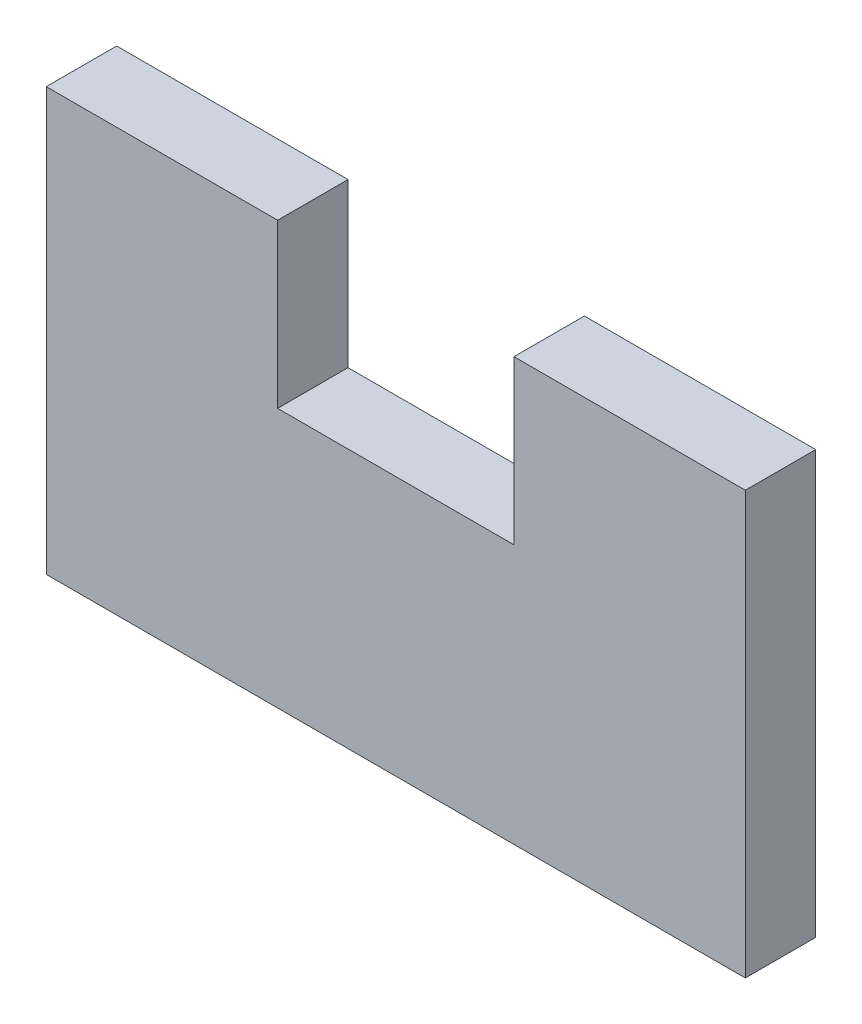
ISO-10303-21;
HEADER;
FILE_DESCRIPTION(('STEP AP214'),'2;1');
FILE_NAME('part.step','',(''),(''),'','','');
FILE_SCHEMA(('AUTOMOTIVE_DESIGN { 1 0 10303 214 1 1 1 1 }'));
ENDSEC;
DATA;
#1=APPLICATION_CONTEXT('core data for automotive mechanical design processes');
#2=APPLICATION_PROTOCOL_DEFINITION('international standard','automotive_design',2000,#1);
#3=PRODUCT_CONTEXT('',#1,'mechanical');
#4=PRODUCT('Part','Part','',(#3));
#5=PRODUCT_RELATED_PRODUCT_CATEGORY('part','',(#4));
#6=PRODUCT_DEFINITION_FORMATION('','',#4);
#7=PRODUCT_DEFINITION_CONTEXT('part definition',#1,'design');
#8=PRODUCT_DEFINITION('design','',#6,#7);
#9=PRODUCT_DEFINITION_SHAPE('','',#8);
#10=(LENGTH_UNIT() NAMED_UNIT(*) SI_UNIT(.MILLI.,.METRE.));
#11=(NAMED_UNIT(*) PLANE_ANGLE_UNIT() SI_UNIT($,.RADIAN.));
#12=(NAMED_UNIT(*) SI_UNIT($,.STERADIAN.) SOLID_ANGLE_UNIT());
#13=UNCERTAINTY_MEASURE_WITH_UNIT(LENGTH_MEASURE(1.E-05),#10,'distance_accuracy_value','');
#14=(GEOMETRIC_REPRESENTATION_CONTEXT(3) GLOBAL_UNCERTAINTY_ASSIGNED_CONTEXT((#13)) GLOBAL_UNIT_ASSIGNED_CONTEXT((#10,
#11,#12)) REPRESENTATION_CONTEXT('',''));
#15=CARTESIAN_POINT('',(0.,0.,0.));
#16=DIRECTION('',(0.,0.,1.));
#17=DIRECTION('',(1.,0.,0.));
#18=AXIS2_PLACEMENT_3D('',#15,#16,#17);
#19=CARTESIAN_POINT('',(61.1765347561429,19.1703444168211,7.));
#20=DIRECTION('',(1.,0.,0.));
#21=DIRECTION('',(0.,1.,0.));
#22=AXIS2_PLACEMENT_3D('',#19,#20,#21);
#23=PLANE('',#22);
#24=DIRECTION('',(0.,-1.,0.));
#25=VECTOR('',#24,1.);
#26=CARTESIAN_POINT('',(61.1765347561429,19.1703444168211,0.));
#27=LINE('',#26,#25);
#28=CARTESIAN_POINT('',(61.1765347561429,19.1703444168211,0.));
#29=VERTEX_POINT('',#28);
#30=CARTESIAN_POINT('',(61.1765347561429,-22.8296555831789,0.));
#31=VERTEX_POINT('',#30);
#32=EDGE_CURVE('E130',#29,#31,#27,.T.);
#33=ORIENTED_EDGE('',*,*,#32,.F.);
#34=DIRECTION('',(0.,0.,-1.));
#35=VECTOR('',#34,1.);
#36=CARTESIAN_POINT('',(61.1765347561429,19.1703444168211,7.));
#37=LINE('',#36,#35);
#38=CARTESIAN_POINT('',(61.1765347561429,19.1703444168211,7.));
#39=VERTEX_POINT('',#38);
#40=EDGE_CURVE('E11',#39,#29,#37,.T.);
#41=ORIENTED_EDGE('',*,*,#40,.F.);
#42=DIRECTION('',(0.,-1.,0.));
#43=VECTOR('',#42,1.);
#44=CARTESIAN_POINT('',(61.1765347561429,19.1703444168211,7.));
#45=LINE('',#44,#43);
#46=CARTESIAN_POINT('',(61.1765347561429,-22.8296555831789,7.));
#47=VERTEX_POINT('',#46);
#48=EDGE_CURVE('E150',#39,#47,#45,.T.);
#49=ORIENTED_EDGE('',*,*,#48,.T.);
#50=DIRECTION('',(0.,0.,-1.));
#51=VECTOR('',#50,1.);
#52=CARTESIAN_POINT('',(61.1765347561429,-22.8296555831789,7.));
#53=LINE('',#52,#51);
#54=EDGE_CURVE('E36',#47,#31,#53,.T.);
#55=ORIENTED_EDGE('',*,*,#54,.T.);
#56=EDGE_LOOP('',(#33,#41,#49,#55));
#57=FACE_BOUND('',#56,.T.);
#58=ADVANCED_FACE('F33',(#57),#23,.T.);
#59=CARTESIAN_POINT('',(38.1765347561429,19.1703444168211,7.));
#60=DIRECTION('',(0.,1.,0.));
#61=DIRECTION('',(0.,0.,1.));
#62=AXIS2_PLACEMENT_3D('',#59,#60,#61);
#63=PLANE('',#62);
#64=DIRECTION('',(1.,0.,0.));
#65=VECTOR('',#64,1.);
#66=CARTESIAN_POINT('',(38.1765347561429,19.1703444168211,0.));
#67=LINE('',#66,#65);
#68=CARTESIAN_POINT('',(38.1765347561429,19.1703444168211,0.));
#69=VERTEX_POINT('',#68);
#70=EDGE_CURVE('E148',#69,#29,#67,.T.);
#71=ORIENTED_EDGE('',*,*,#70,.F.);
#72=DIRECTION('',(0.,0.,-1.));
#73=VECTOR('',#72,1.);
#74=CARTESIAN_POINT('',(38.1765347561429,19.1703444168211,7.));
#75=LINE('',#74,#73);
#76=CARTESIAN_POINT('',(38.1765347561429,19.1703444168211,7.));
#77=VERTEX_POINT('',#76);
#78=EDGE_CURVE('E42',#77,#69,#75,.T.);
#79=ORIENTED_EDGE('',*,*,#78,.F.);
#80=DIRECTION('',(1.,0.,0.));
#81=VECTOR('',#80,1.);
#82=CARTESIAN_POINT('',(38.1765347561429,19.1703444168211,7.));
#83=LINE('',#82,#81);
#84=EDGE_CURVE('E120',#77,#39,#83,.T.);
#85=ORIENTED_EDGE('',*,*,#84,.T.);
#86=ORIENTED_EDGE('',*,*,#40,.T.);
#87=EDGE_LOOP('',(#71,#79,#85,#86));
#88=FACE_BOUND('',#87,.T.);
#89=ADVANCED_FACE('F162',(#88),#63,.T.);
#90=CARTESIAN_POINT('',(38.1765347561429,2.97034441682108,7.));
#91=DIRECTION('',(-1.,0.,0.));
#92=DIRECTION('',(0.,0.,1.));
#93=AXIS2_PLACEMENT_3D('',#90,#91,#92);
#94=PLANE('',#93);
#95=DIRECTION('',(0.,1.,0.));
#96=VECTOR('',#95,1.);
#97=CARTESIAN_POINT('',(38.1765347561429,2.97034441682108,0.));
#98=LINE('',#97,#96);
#99=CARTESIAN_POINT('',(38.1765347561429,2.97034441682108,0.));
#100=VERTEX_POINT('',#99);
#101=EDGE_CURVE('E107',#100,#69,#98,.T.);
#102=ORIENTED_EDGE('',*,*,#101,.F.);
#103=DIRECTION('',(0.,0.,-1.));
#104=VECTOR('',#103,1.);
#105=CARTESIAN_POINT('',(38.1765347561429,2.97034441682108,7.));
#106=LINE('',#105,#104);
#107=CARTESIAN_POINT('',(38.1765347561429,2.97034441682108,7.));
#108=VERTEX_POINT('',#107);
#109=EDGE_CURVE('E102',#108,#100,#106,.T.);
#110=ORIENTED_EDGE('',*,*,#109,.F.);
#111=DIRECTION('',(0.,1.,0.));
#112=VECTOR('',#111,1.);
#113=CARTESIAN_POINT('',(38.1765347561429,2.97034441682108,7.));
#114=LINE('',#113,#112);
#115=EDGE_CURVE('E105',#108,#77,#114,.T.);
#116=ORIENTED_EDGE('',*,*,#115,.T.);
#117=ORIENTED_EDGE('',*,*,#78,.T.);
#118=EDGE_LOOP('',(#102,#110,#116,#117));
#119=FACE_BOUND('',#118,.T.);
#120=ADVANCED_FACE('F104',(#119),#94,.T.);
#121=CARTESIAN_POINT('',(14.6765347561429,2.97034441682108,7.));
#122=DIRECTION('',(0.,1.,0.));
#123=DIRECTION('',(0.,0.,1.));
#124=AXIS2_PLACEMENT_3D('',#121,#122,#123);
#125=PLANE('',#124);
#126=DIRECTION('',(1.,0.,0.));
#127=VECTOR('',#126,1.);
#128=CARTESIAN_POINT('',(14.6765347561429,2.97034441682108,0.));
#129=LINE('',#128,#127);
#130=CARTESIAN_POINT('',(14.6765347561429,2.97034441682108,0.));
#131=VERTEX_POINT('',#130);
#132=EDGE_CURVE('E145',#131,#100,#129,.T.);
#133=ORIENTED_EDGE('',*,*,#132,.F.);
#134=DIRECTION('',(0.,0.,-1.));
#135=VECTOR('',#134,1.);
#136=CARTESIAN_POINT('',(14.6765347561429,2.97034441682108,7.));
#137=LINE('',#136,#135);
#138=CARTESIAN_POINT('',(14.6765347561429,2.97034441682108,7.));
#139=VERTEX_POINT('',#138);
#140=EDGE_CURVE('E112',#139,#131,#137,.T.);
#141=ORIENTED_EDGE('',*,*,#140,.F.);
#142=DIRECTION('',(1.,0.,0.));
#143=VECTOR('',#142,1.);
#144=CARTESIAN_POINT('',(14.6765347561429,2.97034441682108,7.));
#145=LINE('',#144,#143);
#146=EDGE_CURVE('E118',#139,#108,#145,.T.);
#147=ORIENTED_EDGE('',*,*,#146,.T.);
#148=ORIENTED_EDGE('',*,*,#109,.T.);
#149=EDGE_LOOP('',(#133,#141,#147,#148));
#150=FACE_BOUND('',#149,.T.);
#151=ADVANCED_FACE('F122',(#150),#125,.T.);
#152=CARTESIAN_POINT('',(14.6765347561429,19.1703444168211,7.));
#153=DIRECTION('',(1.,0.,0.));
#154=DIRECTION('',(0.,1.,0.));
#155=AXIS2_PLACEMENT_3D('',#152,#153,#154);
#156=PLANE('',#155);
#157=DIRECTION('',(0.,-1.,0.));
#158=VECTOR('',#157,1.);
#159=CARTESIAN_POINT('',(14.6765347561429,19.1703444168211,0.));
#160=LINE('',#159,#158);
#161=CARTESIAN_POINT('',(14.6765347561429,19.1703444168211,0.));
#162=VERTEX_POINT('',#161);
#163=EDGE_CURVE('E142',#162,#131,#160,.T.);
#164=ORIENTED_EDGE('',*,*,#163,.F.);
#165=DIRECTION('',(0.,0.,-1.));
#166=VECTOR('',#165,1.);
#167=CARTESIAN_POINT('',(14.6765347561429,19.1703444168211,7.));
#168=LINE('',#167,#166);
#169=CARTESIAN_POINT('',(14.6765347561429,19.1703444168211,7.));
#170=VERTEX_POINT('',#169);
#171=EDGE_CURVE('E154',#170,#162,#168,.T.);
#172=ORIENTED_EDGE('',*,*,#171,.F.);
#173=DIRECTION('',(0.,-1.,0.));
#174=VECTOR('',#173,1.);
#175=CARTESIAN_POINT('',(14.6765347561429,19.1703444168211,7.));
#176=LINE('',#175,#174);
#177=EDGE_CURVE('E123',#170,#139,#176,.T.);
#178=ORIENTED_EDGE('',*,*,#177,.T.);
#179=ORIENTED_EDGE('',*,*,#140,.T.);
#180=EDGE_LOOP('',(#164,#172,#178,#179));
#181=FACE_BOUND('',#180,.T.);
#182=ADVANCED_FACE('F175',(#181),#156,.T.);
#183=CARTESIAN_POINT('',(-8.32346524385706,19.1703444168211,7.));
#184=DIRECTION('',(0.,1.,0.));
#185=DIRECTION('',(0.,0.,1.));
#186=AXIS2_PLACEMENT_3D('',#183,#184,#185);
#187=PLANE('',#186);
#188=DIRECTION('',(1.,0.,0.));
#189=VECTOR('',#188,1.);
#190=CARTESIAN_POINT('',(-8.32346524385706,19.1703444168211,0.));
#191=LINE('',#190,#189);
#192=CARTESIAN_POINT('',(-8.32346524385706,19.1703444168211,0.));
#193=VERTEX_POINT('',#192);
#194=EDGE_CURVE('E139',#193,#162,#191,.T.);
#195=ORIENTED_EDGE('',*,*,#194,.F.);
#196=DIRECTION('',(0.,0.,-1.));
#197=VECTOR('',#196,1.);
#198=CARTESIAN_POINT('',(-8.32346524385706,19.1703444168211,7.));
#199=LINE('',#198,#197);
#200=CARTESIAN_POINT('',(-8.32346524385706,19.1703444168211,7.));
#201=VERTEX_POINT('',#200);
#202=EDGE_CURVE('E156',#201,#193,#199,.T.);
#203=ORIENTED_EDGE('',*,*,#202,.F.);
#204=DIRECTION('',(1.,0.,0.));
#205=VECTOR('',#204,1.);
#206=CARTESIAN_POINT('',(-8.32346524385706,19.1703444168211,7.));
#207=LINE('',#206,#205);
#208=EDGE_CURVE('E125',#201,#170,#207,.T.);
#209=ORIENTED_EDGE('',*,*,#208,.T.);
#210=ORIENTED_EDGE('',*,*,#171,.T.);
#211=EDGE_LOOP('',(#195,#203,#209,#210));
#212=FACE_BOUND('',#211,.T.);
#213=ADVANCED_FACE('F178',(#212),#187,.T.);
#214=CARTESIAN_POINT('',(-8.32346524385706,-22.8296555831789,7.));
#215=DIRECTION('',(-1.,0.,0.));
#216=DIRECTION('',(0.,0.,1.));
#217=AXIS2_PLACEMENT_3D('',#214,#215,#216);
#218=PLANE('',#217);
#219=DIRECTION('',(0.,1.,0.));
#220=VECTOR('',#219,1.);
#221=CARTESIAN_POINT('',(-8.32346524385706,-22.8296555831789,0.));
#222=LINE('',#221,#220);
#223=CARTESIAN_POINT('',(-8.32346524385706,-22.8296555831789,0.));
#224=VERTEX_POINT('',#223);
#225=EDGE_CURVE('E136',#224,#193,#222,.T.);
#226=ORIENTED_EDGE('',*,*,#225,.F.);
#227=DIRECTION('',(0.,0.,-1.));
#228=VECTOR('',#227,1.);
#229=CARTESIAN_POINT('',(-8.32346524385706,-22.8296555831789,7.));
#230=LINE('',#229,#228);
#231=CARTESIAN_POINT('',(-8.32346524385706,-22.8296555831789,7.));
#232=VERTEX_POINT('',#231);
#233=EDGE_CURVE('E157',#232,#224,#230,.T.);
#234=ORIENTED_EDGE('',*,*,#233,.F.);
#235=DIRECTION('',(0.,1.,0.));
#236=VECTOR('',#235,1.);
#237=CARTESIAN_POINT('',(-8.32346524385706,-22.8296555831789,7.));
#238=LINE('',#237,#236);
#239=EDGE_CURVE('E253',#232,#201,#238,.T.);
#240=ORIENTED_EDGE('',*,*,#239,.T.);
#241=ORIENTED_EDGE('',*,*,#202,.T.);
#242=EDGE_LOOP('',(#226,#234,#240,#241));
#243=FACE_BOUND('',#242,.T.);
#244=ADVANCED_FACE('F182',(#243),#218,.T.);
#245=CARTESIAN_POINT('',(61.1765347561429,-22.8296555831789,7.));
#246=DIRECTION('',(0.,-1.,0.));
#247=DIRECTION('',(1.,0.,0.));
#248=AXIS2_PLACEMENT_3D('',#245,#246,#247);
#249=PLANE('',#248);
#250=DIRECTION('',(-1.,0.,0.));
#251=VECTOR('',#250,1.);
#252=CARTESIAN_POINT('',(61.1765347561429,-22.8296555831789,0.));
#253=LINE('',#252,#251);
#254=EDGE_CURVE('E133',#31,#224,#253,.T.);
#255=ORIENTED_EDGE('',*,*,#254,.F.);
#256=ORIENTED_EDGE('',*,*,#54,.F.);
#257=DIRECTION('',(-1.,0.,0.));
#258=VECTOR('',#257,1.);
#259=CARTESIAN_POINT('',(61.1765347561429,-22.8296555831789,7.));
#260=LINE('',#259,#258);
#261=EDGE_CURVE('E254',#47,#232,#260,.T.);
#262=ORIENTED_EDGE('',*,*,#261,.T.);
#263=ORIENTED_EDGE('',*,*,#233,.T.);
#264=EDGE_LOOP('',(#255,#256,#262,#263));
#265=FACE_BOUND('',#264,.T.);
#266=ADVANCED_FACE('F159',(#265),#249,.T.);
#267=CARTESIAN_POINT('',(0.,0.,7.));
#268=DIRECTION('',(0.,0.,-1.));
#269=DIRECTION('',(-1.,0.,0.));
#270=AXIS2_PLACEMENT_3D('',#267,#268,#269);
#271=PLANE('',#270);
#272=ORIENTED_EDGE('',*,*,#48,.F.);
#273=ORIENTED_EDGE('',*,*,#84,.F.);
#274=ORIENTED_EDGE('',*,*,#115,.F.);
#275=ORIENTED_EDGE('',*,*,#146,.F.);
#276=ORIENTED_EDGE('',*,*,#177,.F.);
#277=ORIENTED_EDGE('',*,*,#208,.F.);
#278=ORIENTED_EDGE('',*,*,#239,.F.);
#279=ORIENTED_EDGE('',*,*,#261,.F.);
#280=EDGE_LOOP('',(#272,#273,#274,#275,#276,#277,#278,#279));
#281=FACE_BOUND('',#280,.T.);
#282=ADVANCED_FACE('F116',(#281),#271,.F.);
#283=CARTESIAN_POINT('',(0.,0.,0.));
#284=DIRECTION('',(0.,0.,-1.));
#285=DIRECTION('',(-1.,0.,0.));
#286=AXIS2_PLACEMENT_3D('',#283,#284,#285);
#287=PLANE('',#286);
#288=ORIENTED_EDGE('',*,*,#32,.T.);
#289=ORIENTED_EDGE('',*,*,#254,.T.);
#290=ORIENTED_EDGE('',*,*,#225,.T.);
#291=ORIENTED_EDGE('',*,*,#194,.T.);
#292=ORIENTED_EDGE('',*,*,#163,.T.);
#293=ORIENTED_EDGE('',*,*,#132,.T.);
#294=ORIENTED_EDGE('',*,*,#101,.T.);
#295=ORIENTED_EDGE('',*,*,#70,.T.);
#296=EDGE_LOOP('',(#288,#289,#290,#291,#292,#293,#294,#295));
#297=FACE_BOUND('',#296,.T.);
#298=ADVANCED_FACE('F161',(#297),#287,.T.);
#299=CLOSED_SHELL('',(#58,#89,#120,#151,#182,#213,#244,#266,#282,#298));
#300=MANIFOLD_SOLID_BREP('B2',#299);
#301=ADVANCED_BREP_SHAPE_REPRESENTATION('',(#18,#300),#14);
#302=SHAPE_DEFINITION_REPRESENTATION(#9,#301);
ENDSEC;
END-ISO-10303-21;
